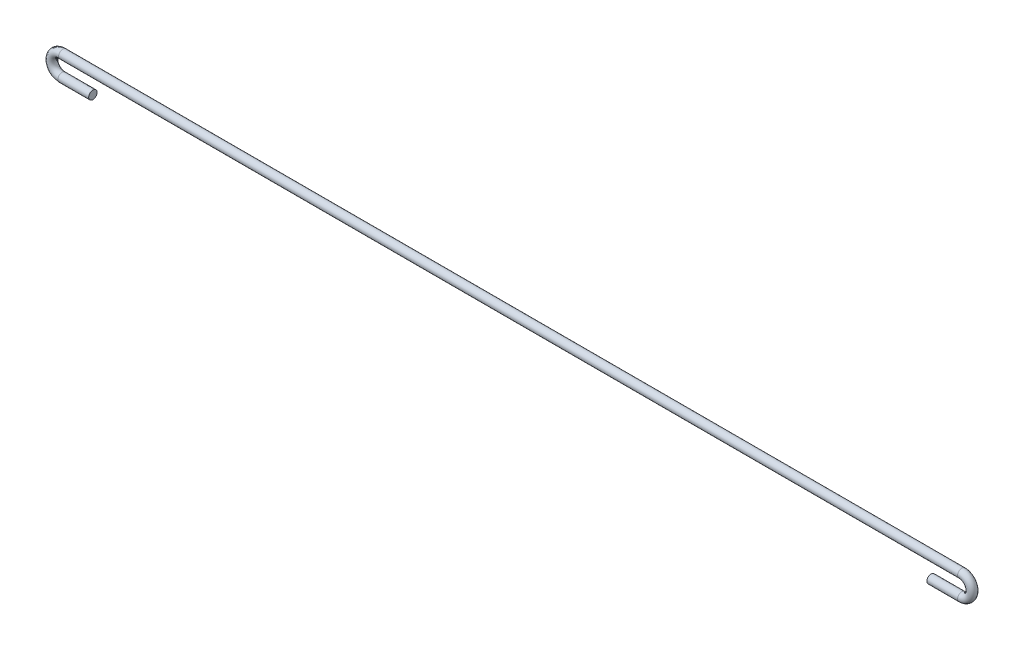
ISO-10303-21;
HEADER;
FILE_DESCRIPTION(('STEP AP214'),'2;1');
FILE_NAME('part.step','',(''),(''),'','','');
FILE_SCHEMA(('AUTOMOTIVE_DESIGN { 1 0 10303 214 1 1 1 1 }'));
ENDSEC;
DATA;
#1=APPLICATION_CONTEXT('core data for automotive mechanical design processes');
#2=APPLICATION_PROTOCOL_DEFINITION('international standard','automotive_design',2000,#1);
#3=PRODUCT_CONTEXT('',#1,'mechanical');
#4=PRODUCT('Part','Part','',(#3));
#5=PRODUCT_RELATED_PRODUCT_CATEGORY('part','',(#4));
#6=PRODUCT_DEFINITION_FORMATION('','',#4);
#7=PRODUCT_DEFINITION_CONTEXT('part definition',#1,'design');
#8=PRODUCT_DEFINITION('design','',#6,#7);
#9=PRODUCT_DEFINITION_SHAPE('','',#8);
#10=(LENGTH_UNIT() NAMED_UNIT(*) SI_UNIT(.MILLI.,.METRE.));
#11=(NAMED_UNIT(*) PLANE_ANGLE_UNIT() SI_UNIT($,.RADIAN.));
#12=(NAMED_UNIT(*) SI_UNIT($,.STERADIAN.) SOLID_ANGLE_UNIT());
#13=UNCERTAINTY_MEASURE_WITH_UNIT(LENGTH_MEASURE(1.E-05),#10,'distance_accuracy_value','');
#14=(GEOMETRIC_REPRESENTATION_CONTEXT(3) GLOBAL_UNCERTAINTY_ASSIGNED_CONTEXT((#13)) GLOBAL_UNIT_ASSIGNED_CONTEXT((#10,
#11,#12)) REPRESENTATION_CONTEXT('',''));
#15=CARTESIAN_POINT('',(0.,0.,0.));
#16=DIRECTION('',(0.,0.,1.));
#17=DIRECTION('',(1.,0.,0.));
#18=AXIS2_PLACEMENT_3D('',#15,#16,#17);
#19=CARTESIAN_POINT('',(130.89921420095,7.3769917706916,0.));
#20=DIRECTION('',(1.,0.,0.));
#21=DIRECTION('',(0.,1.,0.));
#22=AXIS2_PLACEMENT_3D('',#19,#20,#21);
#23=PLANE('',#22);
#24=CARTESIAN_POINT('',(130.89921420095,7.3769917706916,0.));
#25=DIRECTION('',(1.,0.,0.));
#26=DIRECTION('',(0.,1.,0.));
#27=AXIS2_PLACEMENT_3D('',#24,#25,#26);
#28=CIRCLE('',#27,0.8);
#29=CARTESIAN_POINT('',(130.89921420095,8.1769917706916,0.));
#30=VERTEX_POINT('',#29);
#31=EDGE_CURVE('E59',#30,#30,#28,.T.);
#32=ORIENTED_EDGE('',*,*,#31,.F.);
#33=EDGE_LOOP('',(#32));
#34=FACE_BOUND('',#33,.T.);
#35=ADVANCED_FACE('F54',(#34),#23,.F.);
#36=CARTESIAN_POINT('',(-28.5233922788309,7.38053791004458,0.));
#37=DIRECTION('',(1.,0.,0.));
#38=DIRECTION('',(0.,1.,0.));
#39=AXIS2_PLACEMENT_3D('',#36,#37,#38);
#40=PLANE('',#39);
#41=CARTESIAN_POINT('',(-28.5233922788309,7.38053791004458,0.));
#42=DIRECTION('',(1.,0.,0.));
#43=DIRECTION('',(0.,1.,0.));
#44=AXIS2_PLACEMENT_3D('',#41,#42,#43);
#45=CIRCLE('',#44,0.8);
#46=CARTESIAN_POINT('',(-28.5233922788309,8.18053791004458,0.));
#47=VERTEX_POINT('',#46);
#48=EDGE_CURVE('E80',#47,#47,#45,.T.);
#49=ORIENTED_EDGE('',*,*,#48,.T.);
#50=EDGE_LOOP('',(#49));
#51=FACE_BOUND('',#50,.T.);
#52=ADVANCED_FACE('F103',(#51),#40,.T.);
#53=CARTESIAN_POINT('',(136.746671828069,9.32614431306449,0.));
#54=DIRECTION('',(0.,0.,-1.));
#55=DIRECTION('',(-1.,0.,0.));
#56=AXIS2_PLACEMENT_3D('',#53,#54,#55);
#57=TOROIDAL_SURFACE('',#56,1.94915254237288,0.8);
#58=CARTESIAN_POINT('',(136.746671828069,11.2752968554374,0.));
#59=DIRECTION('',(-1.,0.,0.));
#60=DIRECTION('',(0.,-1.,0.));
#61=AXIS2_PLACEMENT_3D('',#58,#59,#60);
#62=CIRCLE('',#61,0.8);
#63=CARTESIAN_POINT('',(136.746671828069,12.0752968554374,0.));
#64=VERTEX_POINT('',#63);
#65=EDGE_CURVE('E134',#64,#64,#62,.T.);
#66=CARTESIAN_POINT('',(136.746671828069,7.37699177069162,0.));
#67=DIRECTION('',(1.,0.,0.));
#68=DIRECTION('',(0.,1.,0.));
#69=AXIS2_PLACEMENT_3D('',#66,#67,#68);
#70=CIRCLE('',#69,0.8);
#71=CARTESIAN_POINT('',(136.746671828069,6.5769917706916,0.));
#72=VERTEX_POINT('',#71);
#73=EDGE_CURVE('E126',#72,#72,#70,.T.);
#74=CARTESIAN_POINT('',(136.746671828069,9.32614431306449,0.));
#75=DIRECTION('',(0.,0.,-1.));
#76=DIRECTION('',(-1.,0.,0.));
#77=AXIS2_PLACEMENT_3D('',#74,#75,#76);
#78=CIRCLE('',#77,2.74915254237288);
#79=EDGE_CURVE('',#64,#72,#78,.T.);
#80=ORIENTED_EDGE('',*,*,#65,.F.);
#81=ORIENTED_EDGE('',*,*,#73,.T.);
#82=ORIENTED_EDGE('',*,*,#79,.T.);
#83=ORIENTED_EDGE('',*,*,#79,.F.);
#84=EDGE_LOOP('',(#80,#82,#81,#83));
#85=FACE_BOUND('',#84,.T.);
#86=ADVANCED_FACE('F98',(#85),#57,.T.);
#87=CARTESIAN_POINT('',(136.746671828069,7.3769917706916,0.));
#88=DIRECTION('',(-1.,0.,0.));
#89=DIRECTION('',(0.,-1.,0.));
#90=AXIS2_PLACEMENT_3D('',#87,#88,#89);
#91=CYLINDRICAL_SURFACE('',#90,0.8);
#92=ORIENTED_EDGE('',*,*,#31,.T.);
#93=EDGE_LOOP('',(#92));
#94=FACE_BOUND('',#93,.T.);
#95=ORIENTED_EDGE('',*,*,#73,.F.);
#96=EDGE_LOOP('',(#95));
#97=FACE_BOUND('',#96,.T.);
#98=ADVANCED_FACE('F105',(#94,#97),#91,.T.);
#99=CARTESIAN_POINT('',(-34.4533281719313,11.2752968554373,0.));
#100=DIRECTION('',(1.,0.,0.));
#101=DIRECTION('',(0.,1.,0.));
#102=AXIS2_PLACEMENT_3D('',#99,#100,#101);
#103=CYLINDRICAL_SURFACE('',#102,0.8);
#104=CARTESIAN_POINT('',(-34.2533281719313,11.2752968554373,-0.8));
#105=CARTESIAN_POINT('',(-34.2530968308643,11.2829795835336,-0.800000623954683));
#106=CARTESIAN_POINT('',(-34.2528661251593,11.2906647202581,-0.799889782222548));
#107=CARTESIAN_POINT('',(-34.2512931234233,11.3432251621796,-0.798371459975028));
#108=CARTESIAN_POINT('',(-34.2499754908202,11.3880606324747,-0.793284713829108));
#109=CARTESIAN_POINT('',(-34.2474315454412,11.4763195751451,-0.775644241261603));
#110=CARTESIAN_POINT('',(-34.2462054667022,11.5197392790308,-0.763072069096311));
#111=CARTESIAN_POINT('',(-34.2438782984436,11.6038068449477,-0.730824024933995));
#112=CARTESIAN_POINT('',(-34.2427770558652,11.6444580763722,-0.711156978368682));
#113=CARTESIAN_POINT('',(-34.2407196055699,11.7218819501061,-0.665272441772583));
#114=CARTESIAN_POINT('',(-34.2397634034196,11.7586544435341,-0.6390547004302));
#115=CARTESIAN_POINT('',(-34.2380103693353,11.8272643361999,-0.580823163202054));
#116=CARTESIAN_POINT('',(-34.2372134821101,11.8591034467308,-0.548811385544911));
#117=CARTESIAN_POINT('',(-34.2357868927207,11.9169589380455,-0.479889994508225));
#118=CARTESIAN_POINT('',(-34.2351572091614,11.9429746708065,-0.442979836766366));
#119=CARTESIAN_POINT('',(-34.2340695859099,11.9884301072355,-0.365327528714173));
#120=CARTESIAN_POINT('',(-34.2336115810471,12.0078723059932,-0.324586839864521));
#121=CARTESIAN_POINT('',(-34.2328687493881,12.0396410499082,-0.240418979870018));
#122=CARTESIAN_POINT('',(-34.2325839194627,12.0519677236358,-0.196991857282026));
#123=CARTESIAN_POINT('',(-34.2321879892407,12.0691536295265,-0.108692497712034));
#124=CARTESIAN_POINT('',(-34.2320768546733,12.0740143347532,-0.0638205475841484));
#125=CARTESIAN_POINT('',(-34.2320282919633,12.0761347397503,0.0261026647373659));
#126=CARTESIAN_POINT('',(-34.2320908637023,12.0733944447071,0.0711539268086241));
#127=CARTESIAN_POINT('',(-34.2323896614782,12.0603913305628,0.16015298456532));
#128=CARTESIAN_POINT('',(-34.2326258730592,12.0501291376733,0.204100871793725));
#129=CARTESIAN_POINT('',(-34.2332715981588,12.0223744525659,0.289650400703875));
#130=CARTESIAN_POINT('',(-34.2336811145957,12.0048818385926,0.331252002862326));
#131=CARTESIAN_POINT('',(-34.2346721863956,11.9631616079917,0.410931429153318));
#132=CARTESIAN_POINT('',(-34.2352537582218,11.9389333468763,0.449008915622467));
#133=CARTESIAN_POINT('',(-34.2365854624454,11.8844341222388,0.520551273521029));
#134=CARTESIAN_POINT('',(-34.2373355760052,11.8541638340672,0.554016659764213));
#135=CARTESIAN_POINT('',(-34.2389976219656,11.7884312829016,0.615398976061311));
#136=CARTESIAN_POINT('',(-34.2399095950521,11.7529677148915,0.643314507326408));
#137=CARTESIAN_POINT('',(-34.2418830347424,11.6778602222403,0.692794659983606));
#138=CARTESIAN_POINT('',(-34.2429444959485,11.6382164485519,0.7143595106004));
#139=CARTESIAN_POINT('',(-34.2451995802731,11.5558040903713,0.7505643545504));
#140=CARTESIAN_POINT('',(-34.2463934556383,11.5130295964865,0.76519084084255));
#141=CARTESIAN_POINT('',(-34.2488823837775,11.4257059071754,0.787015968113085));
#142=CARTESIAN_POINT('',(-34.2501771830217,11.3811612883233,0.794232614944116));
#143=CARTESIAN_POINT('',(-34.2518785646661,11.3237256540953,0.798634443371131));
#144=CARTESIAN_POINT('',(-34.2522562758792,11.3110415857244,0.799302160338079));
#145=CARTESIAN_POINT('',(-34.2528660609002,11.2906672917244,0.799889097915202));
#146=CARTESIAN_POINT('',(-34.2530967548143,11.2829826835319,0.799999756796534));
#147=CARTESIAN_POINT('',(-34.2533281719313,11.2752968554373,0.8));
#148=B_SPLINE_CURVE_WITH_KNOTS('',3,(#104,#105,#106,#107,#108,#109,#110,#111,#112,#113,#114,
#115,#116,#117,#118,#119,#120,#121,#122,#123,#124,#125,#126,#127,#128,#129,#130,#131,#132,#133,
#134,#135,#136,#137,#138,#139,#140,#141,#142,#143,#144,#145,#146,#147),.UNSPECIFIED.,.F.,.F.,(4,
2,2,2,2,2,2,2,2,2,2,2,2,2,2,2,2,2,2,2,2,4),(0.,0.0230645752402661,0.157768707112879,
0.292806161607099,0.427676216728678,0.562551446815001,0.697379786099354,0.832223121570759,
0.967015217494153,1.10180487778352,1.23656794015109,1.37133091056563,1.50608266299318,
1.64083668464348,1.77560360442185,1.91035546898605,2.04514125355495,2.17992217250083,
2.31496440597429,2.44967770563594,2.48779035777109,2.51085493301134),.UNSPECIFIED.);
#149=CARTESIAN_POINT('',(-34.2533281719313,11.2752968554373,-0.8));
#150=VERTEX_POINT('',#149);
#151=CARTESIAN_POINT('',(-34.2533281719313,11.2752968554373,0.8));
#152=VERTEX_POINT('',#151);
#153=EDGE_CURVE('E12',#150,#152,#148,.T.);
#154=ORIENTED_EDGE('',*,*,#153,.T.);
#155=CARTESIAN_POINT('',(-34.2533281719313,11.2752968554373,-0.8));
#156=CARTESIAN_POINT('',(-34.2535594988057,11.2676141264237,-0.800000623987563));
#157=CARTESIAN_POINT('',(-34.2537909040706,11.2599290110107,-0.799889782263213));
#158=CARTESIAN_POINT('',(-34.2553737884195,11.207361903809,-0.798371271200637));
#159=CARTESIAN_POINT('',(-34.2567242626183,11.1625204720645,-0.793283219468146));
#160=CARTESIAN_POINT('',(-34.2593830872598,11.0742514164472,-0.775638670087278));
#161=CARTESIAN_POINT('',(-34.2606913251394,11.0308275675816,-0.763063713965592));
#162=CARTESIAN_POINT('',(-34.2632246614632,10.946753546637,-0.73080929655144));
#163=CARTESIAN_POINT('',(-34.2644498613135,10.9060999911343,-0.711138693178031));
#164=CARTESIAN_POINT('',(-34.2667836902183,10.8286726567956,-0.665246424914641));
#165=CARTESIAN_POINT('',(-34.2678923148027,10.7918990267357,-0.639024508943666));
#166=CARTESIAN_POINT('',(-34.2699610848335,10.7232858173554,-0.580782229388442));
#167=CARTESIAN_POINT('',(-34.270921273513,10.6914448013662,-0.548763560076088));
#168=CARTESIAN_POINT('',(-34.2726661920002,10.6335871352681,-0.479826901457226));
#169=CARTESIAN_POINT('',(-34.2734509023651,10.6075711305648,-0.442908369971956));
#170=CARTESIAN_POINT('',(-34.2748219389609,10.5621196174887,-0.365241992124746));
#171=CARTESIAN_POINT('',(-34.2754083608663,10.542680935546,-0.324496004677105));
#172=CARTESIAN_POINT('',(-34.2763665471083,10.5109204488471,-0.240317216181153));
#173=CARTESIAN_POINT('',(-34.2767383155627,10.4985985075646,-0.196884466692935));
#174=CARTESIAN_POINT('',(-34.277256463457,10.4814252408685,-0.10858237826828));
#175=CARTESIAN_POINT('',(-34.2774029293986,10.4765710483171,-0.063713597433563));
#176=CARTESIAN_POINT('',(-34.2774665519828,10.4744624405517,0.0262023167769843));
#177=CARTESIAN_POINT('',(-34.27738370895,10.4772080145775,0.0712494499002056));
#178=CARTESIAN_POINT('',(-34.276991122909,10.4902195225369,0.160234602094818));
#179=CARTESIAN_POINT('',(-34.2766814218917,10.5004840647238,0.204172824866645));
#180=CARTESIAN_POINT('',(-34.2758440228188,10.5282400540742,0.289702609542647));
#181=CARTESIAN_POINT('',(-34.2753163211073,10.5457316224339,0.331294132079717));
#182=CARTESIAN_POINT('',(-34.2740579103904,10.5874475521933,0.410956521334581));
#183=CARTESIAN_POINT('',(-34.2733271681642,10.6116730153724,0.449026810559263));
#184=CARTESIAN_POINT('',(-34.2716836858996,10.6661639378795,0.520555695450352));
#185=CARTESIAN_POINT('',(-34.2707709656824,10.6964287394022,0.554014792697833));
#186=CARTESIAN_POINT('',(-34.2687886626082,10.7621691701886,0.615406077611396));
#187=CARTESIAN_POINT('',(-34.2677189406395,10.797649420652,0.643333311661484));
#188=CARTESIAN_POINT('',(-34.2654537279155,10.8727937312741,0.692830972259714));
#189=CARTESIAN_POINT('',(-34.2642582416784,10.9124576411278,0.714401627073172));
#190=CARTESIAN_POINT('',(-34.2617743375273,10.994883296987,0.750598672339428));
#191=CARTESIAN_POINT('',(-34.2604858075465,11.0376487789687,0.765216522188919));
#192=CARTESIAN_POINT('',(-34.2578557583315,11.1249540511078,0.787028015746447));
#193=CARTESIAN_POINT('',(-34.2565143759216,11.1694892620567,0.794239670016103));
#194=CARTESIAN_POINT('',(-34.2547854817054,11.2268999627332,0.798636121117144));
#195=CARTESIAN_POINT('',(-34.2544040055344,11.2395680920104,0.7993026212485));
#196=CARTESIAN_POINT('',(-34.2537909816093,11.2599264396656,0.799889097937887));
#197=CARTESIAN_POINT('',(-34.2535595923026,11.2676110262861,0.799999756720357));
#198=CARTESIAN_POINT('',(-34.2533281719313,11.2752968554373,0.8));
#199=B_SPLINE_CURVE_WITH_KNOTS('',3,(#155,#156,#157,#158,#159,#160,#161,#162,#163,#164,#165,
#166,#167,#168,#169,#170,#171,#172,#173,#174,#175,#176,#177,#178,#179,#180,#181,#182,#183,#184,
#185,#186,#187,#188,#189,#190,#191,#192,#193,#194,#195,#196,#197,#198),.UNSPECIFIED.,.F.,.F.,(4,
2,2,2,2,2,2,2,2,2,2,2,2,2,2,2,2,2,2,2,2,4),(0.,0.0230645751201296,0.15778959255805,
0.292848149208282,0.427738684413136,0.56263439013092,0.697490732071547,0.832362008574702,
0.967168116340372,1.10197163792221,1.23672339064595,1.37147495258272,1.50620157856382,
1.64093046398187,1.77568140631773,1.91041767957048,2.04527406499515,2.18012560712495,
2.31514237149527,2.44983001579766,2.48789512598529,2.5109597011054),.UNSPECIFIED.);
#200=EDGE_CURVE('E65',#150,#152,#199,.T.);
#201=ORIENTED_EDGE('',*,*,#200,.F.);
#202=EDGE_LOOP('',(#154,#201));
#203=FACE_BOUND('',#202,.T.);
#204=ORIENTED_EDGE('',*,*,#65,.T.);
#205=EDGE_LOOP('',(#204));
#206=FACE_BOUND('',#205,.T.);
#207=ADVANCED_FACE('F71',(#203,#206),#103,.T.);
#208=CARTESIAN_POINT('',(-28.5233922788309,7.38053791004458,0.));
#209=DIRECTION('',(-1.,0.,0.));
#210=DIRECTION('',(0.,0.,1.));
#211=AXIS2_PLACEMENT_3D('',#208,#209,#210);
#212=CYLINDRICAL_SURFACE('',#211,0.8);
#213=CARTESIAN_POINT('',(-34.3708499059495,7.38053791004458,0.));
#214=DIRECTION('',(1.,0.,0.));
#215=DIRECTION('',(0.,1.,0.));
#216=AXIS2_PLACEMENT_3D('',#213,#214,#215);
#217=CIRCLE('',#216,0.8);
#218=CARTESIAN_POINT('',(-34.3708499059495,8.18053791004458,0.));
#219=VERTEX_POINT('',#218);
#220=EDGE_CURVE('E73',#219,#219,#217,.T.);
#221=ORIENTED_EDGE('',*,*,#220,.T.);
#222=EDGE_LOOP('',(#221));
#223=FACE_BOUND('',#222,.T.);
#224=ORIENTED_EDGE('',*,*,#48,.F.);
#225=EDGE_LOOP('',(#224));
#226=FACE_BOUND('',#225,.T.);
#227=ADVANCED_FACE('F108',(#223,#226),#212,.T.);
#228=CARTESIAN_POINT('',(-34.3708499059495,8.18053791004458,0.));
#229=CARTESIAN_POINT('',(-34.6774747359967,8.18053791004458,0.));
#230=CARTESIAN_POINT('',(-34.982065395589,8.30940364413955,0.));
#231=CARTESIAN_POINT('',(-35.4091071769852,8.74952548873899,0.));
#232=CARTESIAN_POINT('',(-35.5287276087117,9.05786556142664,0.));
#233=CARTESIAN_POINT('',(-35.510231709889,9.67083360533476,0.));
#234=CARTESIAN_POINT('',(-35.3722377713785,9.97140048169298,0.));
#235=CARTESIAN_POINT('',(-35.032636909814,10.2815801469751,0.));
#236=CARTESIAN_POINT('',(-34.8988131740714,10.3618302186254,0.));
#237=CARTESIAN_POINT('',(-34.6820170224212,10.438565164509,0.));
#238=CARTESIAN_POINT('',(-34.6071700856939,10.4568924561429,0.));
#239=CARTESIAN_POINT('',(-34.4932740065161,10.4729462898958,0.));
#240=CARTESIAN_POINT('',(-34.4550374281193,10.4763969907928,0.));
#241=CARTESIAN_POINT('',(-34.3783689251135,10.4794586412805,0.));
#242=CARTESIAN_POINT('',(-34.3532948650014,10.4798721573822,0.));
#243=CARTESIAN_POINT('',(-34.2486739250998,10.4735626605318,0.));
#244=CARTESIAN_POINT('',(-34.1684724224409,10.4687131464793,0.));
#245=CARTESIAN_POINT('',(-34.1019270440184,10.4646935625334,0.));
#246=CARTESIAN_POINT('',(-34.3708499059495,8.18053791004458,1.6));
#247=CARTESIAN_POINT('',(-34.6774747359967,8.18053791004458,1.6));
#248=CARTESIAN_POINT('',(-34.982065395589,8.30940364413955,1.6));
#249=CARTESIAN_POINT('',(-35.4091071769852,8.74952548873899,1.6));
#250=CARTESIAN_POINT('',(-35.5287276087117,9.05786556142664,1.6));
#251=CARTESIAN_POINT('',(-35.510231709889,9.67083360533476,1.6));
#252=CARTESIAN_POINT('',(-35.3722377713785,9.97140048169298,1.6));
#253=CARTESIAN_POINT('',(-35.032636909814,10.2815801469751,1.6));
#254=CARTESIAN_POINT('',(-34.8988131740714,10.3618302186254,1.6));
#255=CARTESIAN_POINT('',(-34.6820170224212,10.438565164509,1.6));
#256=CARTESIAN_POINT('',(-34.6071700856939,10.4568924561429,1.6));
#257=CARTESIAN_POINT('',(-34.4932740065161,10.4729462898958,1.6));
#258=CARTESIAN_POINT('',(-34.4550374281193,10.4763969907928,1.6));
#259=CARTESIAN_POINT('',(-34.3783689251135,10.4794586412805,1.6));
#260=CARTESIAN_POINT('',(-34.3532948650014,10.4798721573822,1.6));
#261=CARTESIAN_POINT('',(-34.2486739250998,10.4735626605318,1.6));
#262=CARTESIAN_POINT('',(-34.1684724224409,10.4687131464793,1.6));
#263=CARTESIAN_POINT('',(-34.1019270440184,10.4646935625334,1.6));
#264=CARTESIAN_POINT('',(-34.3708499059495,6.58053791004458,1.6));
#265=CARTESIAN_POINT('',(-35.104397803201,6.58053791004458,1.6));
#266=CARTESIAN_POINT('',(-35.8330792926756,6.88882732110851,1.6));
#267=CARTESIAN_POINT('',(-36.8547043213109,7.9417441823794,1.6));
#268=CARTESIAN_POINT('',(-37.1408759146295,8.67939550669985,1.6));
#269=CARTESIAN_POINT('',(-37.0966276138923,10.1458175822719,1.6));
#270=CARTESIAN_POINT('',(-36.7665005220609,10.8648728528407,1.6));
#271=CARTESIAN_POINT('',(-35.954063062689,11.6069250904285,1.6));
#272=CARTESIAN_POINT('',(-35.6339124736394,11.7989097751162,1.6));
#273=CARTESIAN_POINT('',(-35.115264453025,11.9824851176274,1.6));
#274=CARTESIAN_POINT('',(-34.9362058521798,12.0263300542501,1.6));
#275=CARTESIAN_POINT('',(-34.6637288014063,12.0647361285089,1.6));
#276=CARTESIAN_POINT('',(-34.5722542731468,12.0729913451088,1.6));
#277=CARTESIAN_POINT('',(-34.388837883949,12.0803158245944,1.6));
#278=CARTESIAN_POINT('',(-34.2835398054226,12.0785680425841,1.6));
#279=CARTESIAN_POINT('',(-34.1248911709615,12.0690089851371,1.6));
#280=CARTESIAN_POINT('',(-34.0720024077339,12.0658022286104,1.6));
#281=CARTESIAN_POINT('',(-34.0054570293114,12.0617826446645,1.6));
#282=CARTESIAN_POINT('',(-34.3708499059495,6.58053791004458,0.));
#283=CARTESIAN_POINT('',(-35.104397803201,6.58053791004458,0.));
#284=CARTESIAN_POINT('',(-35.8330792926756,6.88882732110851,0.));
#285=CARTESIAN_POINT('',(-36.8547043213109,7.9417441823794,0.));
#286=CARTESIAN_POINT('',(-37.1408759146295,8.67939550669985,0.));
#287=CARTESIAN_POINT('',(-37.0966276138923,10.1458175822719,0.));
#288=CARTESIAN_POINT('',(-36.7665005220609,10.8648728528407,0.));
#289=CARTESIAN_POINT('',(-35.954063062689,11.6069250904285,0.));
#290=CARTESIAN_POINT('',(-35.6339124736394,11.7989097751162,0.));
#291=CARTESIAN_POINT('',(-35.115264453025,11.9824851176274,0.));
#292=CARTESIAN_POINT('',(-34.9362058521798,12.0263300542501,0.));
#293=CARTESIAN_POINT('',(-34.6637288014063,12.0647361285089,0.));
#294=CARTESIAN_POINT('',(-34.5722542731468,12.0729913451088,0.));
#295=CARTESIAN_POINT('',(-34.388837883949,12.0803158245944,0.));
#296=CARTESIAN_POINT('',(-34.2835398054226,12.0785680425841,0.));
#297=CARTESIAN_POINT('',(-34.1248911709615,12.0690089851371,0.));
#298=CARTESIAN_POINT('',(-34.0720024077339,12.0658022286104,0.));
#299=CARTESIAN_POINT('',(-34.0054570293114,12.0617826446645,0.));
#300=CARTESIAN_POINT('',(-34.3708499059495,6.58053791004458,-1.6));
#301=CARTESIAN_POINT('',(-35.104397803201,6.58053791004458,-1.6));
#302=CARTESIAN_POINT('',(-35.8330792926756,6.88882732110851,-1.6));
#303=CARTESIAN_POINT('',(-36.8547043213109,7.9417441823794,-1.6));
#304=CARTESIAN_POINT('',(-37.1408759146295,8.67939550669985,-1.6));
#305=CARTESIAN_POINT('',(-37.0966276138923,10.1458175822719,-1.6));
#306=CARTESIAN_POINT('',(-36.7665005220609,10.8648728528407,-1.6));
#307=CARTESIAN_POINT('',(-35.954063062689,11.6069250904285,-1.6));
#308=CARTESIAN_POINT('',(-35.6339124736394,11.7989097751162,-1.6));
#309=CARTESIAN_POINT('',(-35.115264453025,11.9824851176274,-1.6));
#310=CARTESIAN_POINT('',(-34.9362058521798,12.0263300542501,-1.6));
#311=CARTESIAN_POINT('',(-34.6637288014063,12.0647361285089,-1.6));
#312=CARTESIAN_POINT('',(-34.5722542731468,12.0729913451088,-1.6));
#313=CARTESIAN_POINT('',(-34.388837883949,12.0803158245944,-1.6));
#314=CARTESIAN_POINT('',(-34.2835398054226,12.0785680425841,-1.6));
#315=CARTESIAN_POINT('',(-34.1248911709615,12.0690089851371,-1.6));
#316=CARTESIAN_POINT('',(-34.0720024077339,12.0658022286104,-1.6));
#317=CARTESIAN_POINT('',(-34.0054570293114,12.0617826446645,-1.6));
#318=CARTESIAN_POINT('',(-34.3708499059495,8.18053791004458,-1.6));
#319=CARTESIAN_POINT('',(-34.6774747359967,8.18053791004458,-1.6));
#320=CARTESIAN_POINT('',(-34.982065395589,8.30940364413955,-1.6));
#321=CARTESIAN_POINT('',(-35.4091071769852,8.74952548873899,-1.6));
#322=CARTESIAN_POINT('',(-35.5287276087117,9.05786556142664,-1.6));
#323=CARTESIAN_POINT('',(-35.510231709889,9.67083360533476,-1.6));
#324=CARTESIAN_POINT('',(-35.3722377713785,9.97140048169298,-1.6));
#325=CARTESIAN_POINT('',(-35.032636909814,10.2815801469751,-1.6));
#326=CARTESIAN_POINT('',(-34.8988131740714,10.3618302186254,-1.6));
#327=CARTESIAN_POINT('',(-34.6820170224212,10.438565164509,-1.6));
#328=CARTESIAN_POINT('',(-34.6071700856939,10.4568924561429,-1.6));
#329=CARTESIAN_POINT('',(-34.4932740065161,10.4729462898958,-1.6));
#330=CARTESIAN_POINT('',(-34.4550374281193,10.4763969907928,-1.6));
#331=CARTESIAN_POINT('',(-34.3783689251135,10.4794586412805,-1.6));
#332=CARTESIAN_POINT('',(-34.3532948650014,10.4798721573822,-1.6));
#333=CARTESIAN_POINT('',(-34.2486739250998,10.4735626605318,-1.6));
#334=CARTESIAN_POINT('',(-34.1684724224409,10.4687131464793,-1.6));
#335=CARTESIAN_POINT('',(-34.1019270440184,10.4646935625334,-1.6));
#336=CARTESIAN_POINT('',(-34.3708499059495,8.18053791004458,0.));
#337=CARTESIAN_POINT('',(-34.6774747359967,8.18053791004458,0.));
#338=CARTESIAN_POINT('',(-34.982065395589,8.30940364413955,0.));
#339=CARTESIAN_POINT('',(-35.4091071769852,8.74952548873899,0.));
#340=CARTESIAN_POINT('',(-35.5287276087117,9.05786556142664,0.));
#341=CARTESIAN_POINT('',(-35.510231709889,9.67083360533476,0.));
#342=CARTESIAN_POINT('',(-35.3722377713785,9.97140048169298,0.));
#343=CARTESIAN_POINT('',(-35.032636909814,10.2815801469751,0.));
#344=CARTESIAN_POINT('',(-34.8988131740714,10.3618302186254,0.));
#345=CARTESIAN_POINT('',(-34.6820170224212,10.438565164509,0.));
#346=CARTESIAN_POINT('',(-34.6071700856939,10.4568924561429,0.));
#347=CARTESIAN_POINT('',(-34.4932740065161,10.4729462898958,0.));
#348=CARTESIAN_POINT('',(-34.4550374281193,10.4763969907928,0.));
#349=CARTESIAN_POINT('',(-34.3783689251135,10.4794586412805,0.));
#350=CARTESIAN_POINT('',(-34.3532948650014,10.4798721573822,0.));
#351=CARTESIAN_POINT('',(-34.2486739250998,10.4735626605318,0.));
#352=CARTESIAN_POINT('',(-34.1684724224409,10.4687131464793,0.));
#353=CARTESIAN_POINT('',(-34.1019270440184,10.4646935625334,0.));
#354=(BOUNDED_SURFACE() B_SPLINE_SURFACE(3,3,((#228,#229,#230,#231,#232,#233,#234,#235,#236,
#237,#238,#239,#240,#241,#242,#243,#244,#245),(#246,#247,#248,#249,#250,#251,#252,#253,#254,
#255,#256,#257,#258,#259,#260,#261,#262,#263),(#264,#265,#266,#267,#268,#269,#270,#271,#272,
#273,#274,#275,#276,#277,#278,#279,#280,#281),(#282,#283,#284,#285,#286,#287,#288,#289,#290,
#291,#292,#293,#294,#295,#296,#297,#298,#299),(#300,#301,#302,#303,#304,#305,#306,#307,#308,
#309,#310,#311,#312,#313,#314,#315,#316,#317),(#318,#319,#320,#321,#322,#323,#324,#325,#326,
#327,#328,#329,#330,#331,#332,#333,#334,#335),(#336,#337,#338,#339,#340,#341,#342,#343,#344,
#345,#346,#347,#348,#349,#350,#351,#352,#353)),.UNSPECIFIED.,.T.,.F.,
.F.) B_SPLINE_SURFACE_WITH_KNOTS((4,3,4),(4,2,2,2,2,2,2,2,4),(0.,0.5,1.),(0.483720935917669,
0.612790701938252,0.741860467958834,0.870930233979417,0.935465116989709,0.967732558494854,
0.983866279247427,1.,1.01649473520943),
.UNSPECIFIED.) GEOMETRIC_REPRESENTATION_ITEM() RATIONAL_B_SPLINE_SURFACE(((1.,1.,1.,1.,1.,1.,1.,
1.,1.,1.,1.,1.,1.,1.,1.,1.,1.,1.),(0.333333333333333,0.333333333333333,0.333333333333333,
0.333333333333333,0.333333333333333,0.333333333333333,0.333333333333333,0.333333333333333,
0.333333333333333,0.333333333333333,0.333333333333333,0.333333333333333,0.333333333333333,
0.333333333333333,0.333333333333333,0.333333333333333,0.333333333333333,0.333333333333333),
(0.333333333333333,0.333333333333333,0.333333333333333,0.333333333333333,0.333333333333333,
0.333333333333333,0.333333333333333,0.333333333333333,0.333333333333333,0.333333333333333,
0.333333333333333,0.333333333333333,0.333333333333333,0.333333333333333,0.333333333333333,
0.333333333333333,0.333333333333333,0.333333333333333),(1.,1.,1.,1.,1.,1.,1.,1.,1.,1.,1.,1.,1.,
1.,1.,1.,1.,1.),(0.333333333333333,0.333333333333333,0.333333333333333,0.333333333333333,
0.333333333333333,0.333333333333333,0.333333333333333,0.333333333333333,0.333333333333333,
0.333333333333333,0.333333333333333,0.333333333333333,0.333333333333333,0.333333333333333,
0.333333333333333,0.333333333333333,0.333333333333333,0.333333333333333),(0.333333333333333,
0.333333333333333,0.333333333333333,0.333333333333333,0.333333333333333,0.333333333333333,
0.333333333333333,0.333333333333333,0.333333333333333,0.333333333333333,0.333333333333333,
0.333333333333333,0.333333333333333,0.333333333333333,0.333333333333333,0.333333333333333,
0.333333333333333,0.333333333333333),(1.,1.,1.,1.,1.,1.,1.,1.,1.,1.,1.,1.,1.,1.,1.,1.,1.,1.))) REPRESENTATION_ITEM('') SURFACE());
#355=ORIENTED_EDGE('',*,*,#153,.F.);
#356=ORIENTED_EDGE('',*,*,#200,.T.);
#357=EDGE_LOOP('',(#355,#356));
#358=FACE_BOUND('',#357,.T.);
#359=ORIENTED_EDGE('',*,*,#220,.F.);
#360=EDGE_LOOP('',(#359));
#361=FACE_BOUND('',#360,.T.);
#362=ADVANCED_FACE('F67',(#358,#361),#354,.F.);
#363=CLOSED_SHELL('',(#35,#52,#86,#98,#207,#227,#362));
#364=MANIFOLD_SOLID_BREP('B2',#363);
#365=ADVANCED_BREP_SHAPE_REPRESENTATION('',(#18,#364),#14);
#366=SHAPE_DEFINITION_REPRESENTATION(#9,#365);
ENDSEC;
END-ISO-10303-21;
